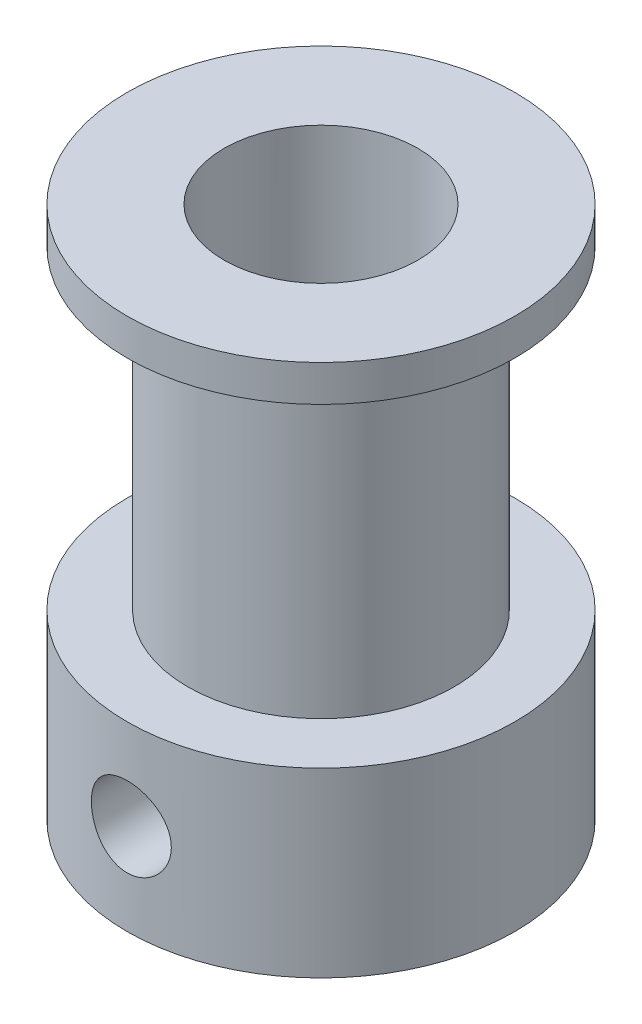
ISO-10303-21;
HEADER;
FILE_DESCRIPTION(('STEP AP214'),'2;1');
FILE_NAME('part.step','',(''),(''),'','','');
FILE_SCHEMA(('AUTOMOTIVE_DESIGN { 1 0 10303 214 1 1 1 1 }'));
ENDSEC;
DATA;
#1=APPLICATION_CONTEXT('core data for automotive mechanical design processes');
#2=APPLICATION_PROTOCOL_DEFINITION('international standard','automotive_design',2000,#1);
#3=PRODUCT_CONTEXT('',#1,'mechanical');
#4=PRODUCT('Part','Part','',(#3));
#5=PRODUCT_RELATED_PRODUCT_CATEGORY('part','',(#4));
#6=PRODUCT_DEFINITION_FORMATION('','',#4);
#7=PRODUCT_DEFINITION_CONTEXT('part definition',#1,'design');
#8=PRODUCT_DEFINITION('design','',#6,#7);
#9=PRODUCT_DEFINITION_SHAPE('','',#8);
#10=(LENGTH_UNIT() NAMED_UNIT(*) SI_UNIT(.MILLI.,.METRE.));
#11=(NAMED_UNIT(*) PLANE_ANGLE_UNIT() SI_UNIT($,.RADIAN.));
#12=(NAMED_UNIT(*) SI_UNIT($,.STERADIAN.) SOLID_ANGLE_UNIT());
#13=UNCERTAINTY_MEASURE_WITH_UNIT(LENGTH_MEASURE(1.E-05),#10,'distance_accuracy_value','');
#14=(GEOMETRIC_REPRESENTATION_CONTEXT(3) GLOBAL_UNCERTAINTY_ASSIGNED_CONTEXT((#13)) GLOBAL_UNIT_ASSIGNED_CONTEXT((#10,
#11,#12)) REPRESENTATION_CONTEXT('',''));
#15=CARTESIAN_POINT('',(0.,0.,0.));
#16=DIRECTION('',(0.,0.,1.));
#17=DIRECTION('',(1.,0.,0.));
#18=AXIS2_PLACEMENT_3D('',#15,#16,#17);
#19=CARTESIAN_POINT('',(0.,7.5,0.));
#20=DIRECTION('',(0.,1.,0.));
#21=DIRECTION('',(0.,0.,1.));
#22=AXIS2_PLACEMENT_3D('',#19,#20,#21);
#23=PLANE('',#22);
#24=CARTESIAN_POINT('',(0.,7.5,0.));
#25=DIRECTION('',(0.,1.,0.));
#26=DIRECTION('',(0.,0.,1.));
#27=AXIS2_PLACEMENT_3D('',#24,#25,#26);
#28=CIRCLE('',#27,8.);
#29=CARTESIAN_POINT('',(0.,7.5,8.));
#30=VERTEX_POINT('',#29);
#31=EDGE_CURVE('E10',#30,#30,#28,.T.);
#32=ORIENTED_EDGE('',*,*,#31,.T.);
#33=EDGE_LOOP('',(#32));
#34=FACE_BOUND('',#33,.T.);
#35=CARTESIAN_POINT('',(0.,7.5,0.));
#36=DIRECTION('',(0.,1.,0.));
#37=DIRECTION('',(0.,0.,1.));
#38=AXIS2_PLACEMENT_3D('',#35,#36,#37);
#39=CIRCLE('',#38,5.5);
#40=CARTESIAN_POINT('',(0.,7.5,-5.5));
#41=VERTEX_POINT('',#40);
#42=EDGE_CURVE('E47',#41,#41,#39,.T.);
#43=ORIENTED_EDGE('',*,*,#42,.F.);
#44=EDGE_LOOP('',(#43));
#45=FACE_BOUND('',#44,.T.);
#46=ADVANCED_FACE('F34',(#34,#45),#23,.T.);
#47=CARTESIAN_POINT('',(0.,7.5,0.));
#48=DIRECTION('',(0.,-1.,0.));
#49=DIRECTION('',(0.,0.,-1.));
#50=AXIS2_PLACEMENT_3D('',#47,#48,#49);
#51=CYLINDRICAL_SURFACE('',#50,8.);
#52=CARTESIAN_POINT('',(-7.82799463464302,3.75,-1.65000000000002));
#53=CARTESIAN_POINT('',(-7.82799647234761,3.84161734979413,-1.64999668532495));
#54=CARTESIAN_POINT('',(-7.82962054015776,3.93327581475285,-1.64234339972767));
#55=CARTESIAN_POINT('',(-7.83593102109728,4.11399536908582,-1.61196056082938));
#56=CARTESIAN_POINT('',(-7.84061980768031,4.20305438944651,-1.5892193225455));
#57=CARTESIAN_POINT('',(-7.85250661788931,4.37593449220463,-1.52939944297716));
#58=CARTESIAN_POINT('',(-7.85970206178507,4.45976085561278,-1.49233553761894));
#59=CARTESIAN_POINT('',(-7.87578836285869,4.62000460226487,-1.40496339378159));
#60=CARTESIAN_POINT('',(-7.88467914491255,4.69642231357555,-1.35465574212319));
#61=CARTESIAN_POINT('',(-7.90330366333984,4.84083130314562,-1.24141806188278));
#62=CARTESIAN_POINT('',(-7.91304715328143,4.90869500128048,-1.17832691131061));
#63=CARTESIAN_POINT('',(-7.93219354684102,5.03295461376032,-1.04166118718971));
#64=CARTESIAN_POINT('',(-7.9415964257225,5.08934969657567,-0.968085854144728));
#65=CARTESIAN_POINT('',(-7.95910768239297,5.18956942635827,-0.811692001393481));
#66=CARTESIAN_POINT('',(-7.9672032148807,5.23327235381807,-0.728793920101091));
#67=CARTESIAN_POINT('',(-7.98107786735649,5.30608110943423,-0.556636173632906));
#68=CARTESIAN_POINT('',(-7.9868572180665,5.33518839158008,-0.467377143134544));
#69=CARTESIAN_POINT('',(-7.99537941797959,5.37758111250497,-0.286356118265347));
#70=CARTESIAN_POINT('',(-7.99816360714569,5.39108215209675,-0.194646593521417));
#71=CARTESIAN_POINT('',(-8.00052470522147,5.40255227142173,-0.0102247919218536));
#72=CARTESIAN_POINT('',(-8.00010194196704,5.40052293877214,0.0824873814688407));
#73=CARTESIAN_POINT('',(-7.9961286601365,5.3811524880959,0.264799667160857));
#74=CARTESIAN_POINT('',(-7.99262559257093,5.36404365512093,0.354425644609033));
#75=CARTESIAN_POINT('',(-7.98293899531616,5.3153688535758,0.529506535845897));
#76=CARTESIAN_POINT('',(-7.97675535366161,5.28380228111471,0.614961275239523));
#77=CARTESIAN_POINT('',(-7.96232481023259,5.20689604030914,0.779930808135305));
#78=CARTESIAN_POINT('',(-7.95406448397429,5.161466330109,0.859402403191171));
#79=CARTESIAN_POINT('',(-7.93638961806162,5.05819018594217,1.00967984091352));
#80=CARTESIAN_POINT('',(-7.9269749376687,5.00034223730045,1.08048462481767));
#81=CARTESIAN_POINT('',(-7.9078239642189,4.87260050730487,1.21279807501822));
#82=CARTESIAN_POINT('',(-7.89808494418977,4.80250342398988,1.27411022634261));
#83=CARTESIAN_POINT('',(-7.87954771497238,4.65292295474092,1.38414252261931));
#84=CARTESIAN_POINT('',(-7.87074952591437,4.57343936804768,1.43286239817595));
#85=CARTESIAN_POINT('',(-7.85508413098618,4.40704845467704,1.51640121308691));
#86=CARTESIAN_POINT('',(-7.84822159457677,4.32012382444695,1.55118662114804));
#87=CARTESIAN_POINT('',(-7.83727167258975,4.14148889177413,1.60559987539901));
#88=CARTESIAN_POINT('',(-7.83318390018328,4.04977925832742,1.625229834457));
#89=CARTESIAN_POINT('',(-7.82832430034405,3.86596343547278,1.64847767759944));
#90=CARTESIAN_POINT('',(-7.82749355348184,3.77389475085064,1.65238010858403));
#91=CARTESIAN_POINT('',(-7.82908365669821,3.59042212630601,1.64482933127382));
#92=CARTESIAN_POINT('',(-7.83150430988349,3.49901814646834,1.63337705280602));
#93=CARTESIAN_POINT('',(-7.83926913983493,3.32043707429369,1.59568777426683));
#94=CARTESIAN_POINT('',(-7.84458293687797,3.23322613369048,1.56960432546506));
#95=CARTESIAN_POINT('',(-7.85750843647708,3.06441223673719,1.50355797289369));
#96=CARTESIAN_POINT('',(-7.86512033846231,2.98280976784409,1.46359386451762));
#97=CARTESIAN_POINT('',(-7.88191579950282,2.82628854815773,1.37028211396983));
#98=CARTESIAN_POINT('',(-7.89111960565472,2.75147762450433,1.31675731908656));
#99=CARTESIAN_POINT('',(-7.91000699478186,2.61179547619869,1.1980782934733));
#100=CARTESIAN_POINT('',(-7.91969063034348,2.54692534419905,1.13292278604277));
#101=CARTESIAN_POINT('',(-7.93863877717958,2.42787906230575,0.991551131023601));
#102=CARTESIAN_POINT('',(-7.94789380519354,2.37389583014193,0.91517105125856));
#103=CARTESIAN_POINT('',(-7.96477402593325,2.27952771722255,0.754260738130239));
#104=CARTESIAN_POINT('',(-7.97239928979603,2.23914224289872,0.669730860728551));
#105=CARTESIAN_POINT('',(-7.98512048804082,2.17339319408157,0.495414150876506));
#106=CARTESIAN_POINT('',(-7.99023131933467,2.14794096923201,0.405661891513242));
#107=CARTESIAN_POINT('',(-7.99741186635557,2.11250124752192,0.223039444294558));
#108=CARTESIAN_POINT('',(-7.99948197278732,2.10251176383492,0.130169658580894));
#109=CARTESIAN_POINT('',(-8.00033781964049,2.09836207224363,-0.054212649205602));
#110=CARTESIAN_POINT('',(-7.99918360281958,2.10391248751722,-0.145718502140326));
#111=CARTESIAN_POINT('',(-7.99384751004402,2.13004339509045,-0.326463478938194));
#112=CARTESIAN_POINT('',(-7.98966567723011,2.15062367322843,-0.415702635080924));
#113=CARTESIAN_POINT('',(-7.97874682116245,2.2060981411582,-0.589186560182822));
#114=CARTESIAN_POINT('',(-7.97201637401338,2.24095551098701,-0.673443542985833));
#115=CARTESIAN_POINT('',(-7.95672300876336,2.32395704210639,-0.834953513276977));
#116=CARTESIAN_POINT('',(-7.9481599348062,2.37210233357252,-0.912205904261803));
#117=CARTESIAN_POINT('',(-7.92995681960444,2.48127864528561,-1.05893847166516));
#118=CARTESIAN_POINT('',(-7.92030089151861,2.54251556975004,-1.12826349061001));
#119=CARTESIAN_POINT('',(-7.90109178015231,2.67571624164646,-1.25575285452555));
#120=CARTESIAN_POINT('',(-7.89153862187156,2.74768253854538,-1.31391453937946));
#121=CARTESIAN_POINT('',(-7.87349423401939,2.9013011038279,-1.41807001635076));
#122=CARTESIAN_POINT('',(-7.86501660134748,2.98305600230841,-1.46391490783106));
#123=CARTESIAN_POINT('',(-7.85025069483304,3.15326288616914,-1.54114313624578));
#124=CARTESIAN_POINT('',(-7.84396047891661,3.2417088455668,-1.57253930936732));
#125=CARTESIAN_POINT('',(-7.83550744278865,3.40026722430231,-1.6140462079898));
#126=CARTESIAN_POINT('',(-7.83270799535492,3.46948894840103,-1.6275042042483));
#127=CARTESIAN_POINT('',(-7.82895092043293,3.60913237654465,-1.64548220150441));
#128=CARTESIAN_POINT('',(-7.82799322160417,3.67955403400329,-1.65000254870381));
#129=CARTESIAN_POINT('',(-7.82799463464302,3.75,-1.65000000000002));
#130=B_SPLINE_CURVE_WITH_KNOTS('',3,(#52,#53,#54,#55,#56,#57,#58,#59,#60,#61,#62,#63,#64,#65,
#66,#67,#68,#69,#70,#71,#72,#73,#74,#75,#76,#77,#78,#79,#80,#81,#82,#83,#84,#85,#86,#87,#88,#89,
#90,#91,#92,#93,#94,#95,#96,#97,#98,#99,#100,#101,#102,#103,#104,#105,#106,#107,#108,#109,#110,
#111,#112,#113,#114,#115,#116,#117,#118,#119,#120,#121,#122,#123,#124,#125,#126,#127,#128,#129),
.UNSPECIFIED.,.T.,.F.,(4,2,2,2,2,2,2,2,2,2,2,2,2,2,2,2,2,2,2,2,2,2,2,2,2,2,2,2,2,2,2,2,2,2,2,2,
2,2,4),(0.,0.274594036981749,0.549400984088786,0.823925944657621,1.09843874327276,
1.3766547467594,1.65489091505464,1.93571338943598,2.21650788327397,2.49337499570617,
2.77021380533169,3.04286128513493,3.31552015429503,3.58998907522695,3.86449149267072,
4.14407920367273,4.4236728956019,4.70393540521657,4.9841588355065,5.25928898855093,
5.53440248143716,5.80668132243981,6.07898379854718,6.35504561674318,6.6311377568341,
6.91175972338565,7.19236943866019,7.47129602001294,7.75018675877315,8.02391884651822,
8.29764703391013,8.57067368982019,8.84372357458458,9.1214337806041,9.39921008040027,
9.68020708192079,9.96095396255218,10.1721016499172,10.38324115827),.UNSPECIFIED.);
#131=CARTESIAN_POINT('',(-7.82799463464302,3.75,-1.65000000000002));
#132=VERTEX_POINT('',#131);
#133=EDGE_CURVE('E93',#132,#132,#130,.T.);
#134=ORIENTED_EDGE('',*,*,#133,.T.);
#135=EDGE_LOOP('',(#134));
#136=FACE_BOUND('',#135,.T.);
#137=CARTESIAN_POINT('',(-1.64999999999999,3.75,7.82799463464303));
#138=CARTESIAN_POINT('',(-1.64999668532493,3.84161734979413,7.82799647234762));
#139=CARTESIAN_POINT('',(-1.64234339972764,3.93327581475285,7.82962054015776));
#140=CARTESIAN_POINT('',(-1.61196056082935,4.11399536908582,7.83593102109728));
#141=CARTESIAN_POINT('',(-1.58921932254547,4.20305438944651,7.84061980768031));
#142=CARTESIAN_POINT('',(-1.52939944297714,4.37593449220463,7.85250661788931));
#143=CARTESIAN_POINT('',(-1.49233553761891,4.45976085561278,7.85970206178508));
#144=CARTESIAN_POINT('',(-1.40496339378156,4.62000460226487,7.8757883628587));
#145=CARTESIAN_POINT('',(-1.35465574212316,4.69642231357555,7.88467914491256));
#146=CARTESIAN_POINT('',(-1.24141806188275,4.84083130314562,7.90330366333985));
#147=CARTESIAN_POINT('',(-1.17832691131059,4.90869500128048,7.91304715328143));
#148=CARTESIAN_POINT('',(-1.04166118718968,5.03295461376032,7.93219354684102));
#149=CARTESIAN_POINT('',(-0.9680858541447,5.08934969657567,7.9415964257225));
#150=CARTESIAN_POINT('',(-0.811692001393454,5.18956942635827,7.95910768239297));
#151=CARTESIAN_POINT('',(-0.728793920101063,5.23327235381807,7.9672032148807));
#152=CARTESIAN_POINT('',(-0.556636173632879,5.30608110943423,7.98107786735649));
#153=CARTESIAN_POINT('',(-0.467377143134516,5.33518839158008,7.9868572180665));
#154=CARTESIAN_POINT('',(-0.28635611826532,5.37758111250497,7.99537941797959));
#155=CARTESIAN_POINT('',(-0.194646593521389,5.39108215209675,7.99816360714569));
#156=CARTESIAN_POINT('',(-0.010224791921826,5.40255227142173,8.00052470522147));
#157=CARTESIAN_POINT('',(0.0824873814688682,5.40052293877214,8.00010194196704));
#158=CARTESIAN_POINT('',(0.264799667160884,5.3811524880959,7.9961286601365));
#159=CARTESIAN_POINT('',(0.354425644609061,5.36404365512093,7.99262559257093));
#160=CARTESIAN_POINT('',(0.529506535845924,5.3153688535758,7.98293899531616));
#161=CARTESIAN_POINT('',(0.61496127523955,5.28380228111471,7.97675535366161));
#162=CARTESIAN_POINT('',(0.779930808135332,5.20689604030914,7.96232481023259));
#163=CARTESIAN_POINT('',(0.859402403191199,5.161466330109,7.95406448397429));
#164=CARTESIAN_POINT('',(1.00967984091354,5.05819018594217,7.93638961806161));
#165=CARTESIAN_POINT('',(1.08048462481769,5.00034223730045,7.92697493766869));
#166=CARTESIAN_POINT('',(1.21279807501824,4.87260050730487,7.9078239642189));
#167=CARTESIAN_POINT('',(1.27411022634264,4.80250342398989,7.89808494418976));
#168=CARTESIAN_POINT('',(1.38414252261934,4.65292295474092,7.87954771497238));
#169=CARTESIAN_POINT('',(1.43286239817597,4.57343936804768,7.87074952591437));
#170=CARTESIAN_POINT('',(1.51640121308694,4.40704845467704,7.85508413098618));
#171=CARTESIAN_POINT('',(1.55118662114807,4.32012382444695,7.84822159457677));
#172=CARTESIAN_POINT('',(1.60559987539903,4.14148889177413,7.83727167258975));
#173=CARTESIAN_POINT('',(1.62522983445702,4.04977925832743,7.83318390018328));
#174=CARTESIAN_POINT('',(1.64847767759947,3.86596343547278,7.82832430034404));
#175=CARTESIAN_POINT('',(1.65238010858406,3.77389475085064,7.82749355348184));
#176=CARTESIAN_POINT('',(1.64482933127385,3.59042212630601,7.8290836566982));
#177=CARTESIAN_POINT('',(1.63337705280605,3.49901814646834,7.83150430988348));
#178=CARTESIAN_POINT('',(1.59568777426686,3.32043707429369,7.83926913983493));
#179=CARTESIAN_POINT('',(1.56960432546508,3.23322613369048,7.84458293687796));
#180=CARTESIAN_POINT('',(1.50355797289372,3.06441223673719,7.85750843647708));
#181=CARTESIAN_POINT('',(1.46359386451765,2.98280976784409,7.8651203384623));
#182=CARTESIAN_POINT('',(1.37028211396986,2.82628854815773,7.88191579950281));
#183=CARTESIAN_POINT('',(1.31675731908659,2.75147762450433,7.89111960565472));
#184=CARTESIAN_POINT('',(1.19807829347332,2.61179547619869,7.91000699478186));
#185=CARTESIAN_POINT('',(1.1329227860428,2.54692534419906,7.91969063034348));
#186=CARTESIAN_POINT('',(0.99155113102363,2.42787906230575,7.93863877717957));
#187=CARTESIAN_POINT('',(0.915171051258588,2.37389583014193,7.94789380519354));
#188=CARTESIAN_POINT('',(0.754260738130267,2.27952771722255,7.96477402593325));
#189=CARTESIAN_POINT('',(0.66973086072858,2.23914224289872,7.97239928979603));
#190=CARTESIAN_POINT('',(0.495414150876535,2.17339319408157,7.98512048804082));
#191=CARTESIAN_POINT('',(0.405661891513271,2.14794096923201,7.99023131933467));
#192=CARTESIAN_POINT('',(0.223039444294587,2.11250124752192,7.99741186635557));
#193=CARTESIAN_POINT('',(0.130169658580922,2.10251176383492,7.99948197278732));
#194=CARTESIAN_POINT('',(-0.0542126492055734,2.09836207224363,8.00033781964049));
#195=CARTESIAN_POINT('',(-0.145718502140298,2.10391248751722,7.99918360281958));
#196=CARTESIAN_POINT('',(-0.326463478938166,2.13004339509045,7.99384751004402));
#197=CARTESIAN_POINT('',(-0.415702635080896,2.15062367322843,7.98966567723011));
#198=CARTESIAN_POINT('',(-0.589186560182793,2.2060981411582,7.97874682116246));
#199=CARTESIAN_POINT('',(-0.673443542985804,2.240955510987,7.97201637401338));
#200=CARTESIAN_POINT('',(-0.834953513276948,2.32395704210639,7.95672300876336));
#201=CARTESIAN_POINT('',(-0.912205904261775,2.37210233357252,7.9481599348062));
#202=CARTESIAN_POINT('',(-1.05893847166513,2.48127864528561,7.92995681960444));
#203=CARTESIAN_POINT('',(-1.12826349060999,2.54251556975004,7.92030089151861));
#204=CARTESIAN_POINT('',(-1.25575285452552,2.67571624164646,7.90109178015231));
#205=CARTESIAN_POINT('',(-1.31391453937944,2.74768253854538,7.89153862187157));
#206=CARTESIAN_POINT('',(-1.41807001635073,2.90130110382791,7.8734942340194));
#207=CARTESIAN_POINT('',(-1.46391490783103,2.98305600230841,7.86501660134749));
#208=CARTESIAN_POINT('',(-1.54114313624576,3.15326288616914,7.85025069483304));
#209=CARTESIAN_POINT('',(-1.57253930936729,3.2417088455668,7.84396047891661));
#210=CARTESIAN_POINT('',(-1.61404620798977,3.40026722430231,7.83550744278865));
#211=CARTESIAN_POINT('',(-1.62750420424827,3.46948894840103,7.83270799535493));
#212=CARTESIAN_POINT('',(-1.64548220150438,3.60913237654465,7.82895092043294));
#213=CARTESIAN_POINT('',(-1.65000254870379,3.67955403400329,7.82799322160417));
#214=CARTESIAN_POINT('',(-1.64999999999999,3.75,7.82799463464303));
#215=B_SPLINE_CURVE_WITH_KNOTS('',3,(#137,#138,#139,#140,#141,#142,#143,#144,#145,#146,#147,
#148,#149,#150,#151,#152,#153,#154,#155,#156,#157,#158,#159,#160,#161,#162,#163,#164,#165,#166,
#167,#168,#169,#170,#171,#172,#173,#174,#175,#176,#177,#178,#179,#180,#181,#182,#183,#184,#185,
#186,#187,#188,#189,#190,#191,#192,#193,#194,#195,#196,#197,#198,#199,#200,#201,#202,#203,#204,
#205,#206,#207,#208,#209,#210,#211,#212,#213,#214),.UNSPECIFIED.,.T.,.F.,(4,2,2,2,2,2,2,2,2,2,2,
2,2,2,2,2,2,2,2,2,2,2,2,2,2,2,2,2,2,2,2,2,2,2,2,2,2,2,4),(0.,0.274594036981749,
0.549400984088785,0.82392594465762,1.09843874327276,1.3766547467594,1.65489091505464,
1.93571338943597,2.21650788327397,2.49337499570617,2.77021380533169,3.04286128513493,
3.31552015429503,3.58998907522695,3.86449149267071,4.14407920367273,4.42367289560189,
4.70393540521657,4.9841588355065,5.25928898855093,5.53440248143716,5.8066813224398,
6.07898379854718,6.35504561674318,6.6311377568341,6.91175972338564,7.19236943866019,
7.47129602001293,7.75018675877315,8.02391884651822,8.29764703391013,8.57067368982019,
8.84372357458458,9.1214337806041,9.39921008040027,9.68020708192079,9.96095396255218,
10.1721016499172,10.38324115827),.UNSPECIFIED.);
#216=CARTESIAN_POINT('',(-1.64999999999999,3.75,7.82799463464303));
#217=VERTEX_POINT('',#216);
#218=EDGE_CURVE('E72',#217,#217,#215,.T.);
#219=ORIENTED_EDGE('',*,*,#218,.T.);
#220=EDGE_LOOP('',(#219));
#221=FACE_BOUND('',#220,.T.);
#222=ORIENTED_EDGE('',*,*,#31,.F.);
#223=EDGE_LOOP('',(#222));
#224=FACE_BOUND('',#223,.T.);
#225=CARTESIAN_POINT('',(0.,0.,0.));
#226=DIRECTION('',(0.,1.,0.));
#227=DIRECTION('',(0.,0.,1.));
#228=AXIS2_PLACEMENT_3D('',#225,#226,#227);
#229=CIRCLE('',#228,8.);
#230=CARTESIAN_POINT('',(0.,0.,8.));
#231=VERTEX_POINT('',#230);
#232=EDGE_CURVE('E38',#231,#231,#229,.T.);
#233=ORIENTED_EDGE('',*,*,#232,.T.);
#234=EDGE_LOOP('',(#233));
#235=FACE_BOUND('',#234,.T.);
#236=ADVANCED_FACE('F36',(#136,#221,#224,#235),#51,.T.);
#237=CARTESIAN_POINT('',(0.,0.,0.));
#238=DIRECTION('',(0.,1.,0.));
#239=DIRECTION('',(0.,0.,1.));
#240=AXIS2_PLACEMENT_3D('',#237,#238,#239);
#241=PLANE('',#240);
#242=CARTESIAN_POINT('',(0.,0.,0.));
#243=DIRECTION('',(0.,1.,0.));
#244=DIRECTION('',(0.,0.,1.));
#245=AXIS2_PLACEMENT_3D('',#242,#243,#244);
#246=CIRCLE('',#245,4.);
#247=CARTESIAN_POINT('',(0.,0.,4.));
#248=VERTEX_POINT('',#247);
#249=EDGE_CURVE('E56',#248,#248,#246,.T.);
#250=ORIENTED_EDGE('',*,*,#249,.T.);
#251=EDGE_LOOP('',(#250));
#252=FACE_BOUND('',#251,.T.);
#253=ORIENTED_EDGE('',*,*,#232,.F.);
#254=EDGE_LOOP('',(#253));
#255=FACE_BOUND('',#254,.T.);
#256=ADVANCED_FACE('F138',(#252,#255),#241,.F.);
#257=CARTESIAN_POINT('',(0.,20.5,0.));
#258=DIRECTION('',(0.,-1.,0.));
#259=DIRECTION('',(0.,0.,-1.));
#260=AXIS2_PLACEMENT_3D('',#257,#258,#259);
#261=CYLINDRICAL_SURFACE('',#260,5.5);
#262=CARTESIAN_POINT('',(0.,20.5,0.));
#263=DIRECTION('',(0.,1.,0.));
#264=DIRECTION('',(0.,0.,1.));
#265=AXIS2_PLACEMENT_3D('',#262,#263,#264);
#266=CIRCLE('',#265,5.5);
#267=CARTESIAN_POINT('',(0.,20.5,-5.5));
#268=VERTEX_POINT('',#267);
#269=EDGE_CURVE('E45',#268,#268,#266,.T.);
#270=CARTESIAN_POINT('',(0.,20.5,-5.5));
#271=CARTESIAN_POINT('',(0.,20.3645833333333,-5.5));
#272=CARTESIAN_POINT('',(0.,20.2291666666667,-5.5));
#273=CARTESIAN_POINT('',(0.,19.9583333333333,-5.5));
#274=CARTESIAN_POINT('',(0.,19.8229166666667,-5.5));
#275=CARTESIAN_POINT('',(0.,19.5520833333333,-5.5));
#276=CARTESIAN_POINT('',(0.,19.4166666666667,-5.5));
#277=CARTESIAN_POINT('',(0.,19.1458333333333,-5.5));
#278=CARTESIAN_POINT('',(0.,19.0104166666667,-5.5));
#279=CARTESIAN_POINT('',(0.,18.7395833333333,-5.5));
#280=CARTESIAN_POINT('',(0.,18.6041666666667,-5.5));
#281=CARTESIAN_POINT('',(0.,18.3333333333333,-5.5));
#282=CARTESIAN_POINT('',(0.,18.1979166666667,-5.5));
#283=CARTESIAN_POINT('',(0.,17.9270833333333,-5.5));
#284=CARTESIAN_POINT('',(0.,17.7916666666667,-5.5));
#285=CARTESIAN_POINT('',(0.,17.5208333333333,-5.5));
#286=CARTESIAN_POINT('',(0.,17.3854166666667,-5.5));
#287=CARTESIAN_POINT('',(0.,17.1145833333333,-5.5));
#288=CARTESIAN_POINT('',(0.,16.9791666666667,-5.5));
#289=CARTESIAN_POINT('',(0.,16.7083333333333,-5.5));
#290=CARTESIAN_POINT('',(0.,16.5729166666667,-5.5));
#291=CARTESIAN_POINT('',(0.,16.3020833333333,-5.5));
#292=CARTESIAN_POINT('',(0.,16.1666666666667,-5.5));
#293=CARTESIAN_POINT('',(0.,15.8958333333333,-5.5));
#294=CARTESIAN_POINT('',(0.,15.7604166666667,-5.5));
#295=CARTESIAN_POINT('',(0.,15.4895833333333,-5.5));
#296=CARTESIAN_POINT('',(0.,15.3541666666667,-5.5));
#297=CARTESIAN_POINT('',(0.,15.0833333333333,-5.5));
#298=CARTESIAN_POINT('',(0.,14.9479166666667,-5.5));
#299=CARTESIAN_POINT('',(0.,14.6770833333333,-5.5));
#300=CARTESIAN_POINT('',(0.,14.5416666666667,-5.5));
#301=CARTESIAN_POINT('',(0.,14.2708333333333,-5.5));
#302=CARTESIAN_POINT('',(0.,14.1354166666667,-5.5));
#303=CARTESIAN_POINT('',(0.,13.8645833333333,-5.5));
#304=CARTESIAN_POINT('',(0.,13.7291666666667,-5.5));
#305=CARTESIAN_POINT('',(0.,13.4583333333333,-5.5));
#306=CARTESIAN_POINT('',(0.,13.3229166666667,-5.5));
#307=CARTESIAN_POINT('',(0.,13.0520833333333,-5.5));
#308=CARTESIAN_POINT('',(0.,12.9166666666667,-5.5));
#309=CARTESIAN_POINT('',(0.,12.6458333333333,-5.5));
#310=CARTESIAN_POINT('',(0.,12.5104166666667,-5.5));
#311=CARTESIAN_POINT('',(0.,12.2395833333333,-5.5));
#312=CARTESIAN_POINT('',(0.,12.1041666666667,-5.5));
#313=CARTESIAN_POINT('',(0.,11.8333333333333,-5.5));
#314=CARTESIAN_POINT('',(0.,11.6979166666667,-5.5));
#315=CARTESIAN_POINT('',(0.,11.4270833333333,-5.5));
#316=CARTESIAN_POINT('',(0.,11.2916666666667,-5.5));
#317=CARTESIAN_POINT('',(0.,11.0208333333333,-5.5));
#318=CARTESIAN_POINT('',(0.,10.8854166666667,-5.5));
#319=CARTESIAN_POINT('',(0.,10.6145833333333,-5.5));
#320=CARTESIAN_POINT('',(0.,10.4791666666667,-5.5));
#321=CARTESIAN_POINT('',(0.,10.2083333333333,-5.5));
#322=CARTESIAN_POINT('',(0.,10.0729166666667,-5.5));
#323=CARTESIAN_POINT('',(0.,9.80208333333333,-5.5));
#324=CARTESIAN_POINT('',(0.,9.66666666666667,-5.5));
#325=CARTESIAN_POINT('',(0.,9.39583333333333,-5.5));
#326=CARTESIAN_POINT('',(0.,9.26041666666666,-5.5));
#327=CARTESIAN_POINT('',(0.,8.98958333333333,-5.5));
#328=CARTESIAN_POINT('',(0.,8.85416666666666,-5.5));
#329=CARTESIAN_POINT('',(0.,8.58333333333333,-5.5));
#330=CARTESIAN_POINT('',(0.,8.44791666666666,-5.5));
#331=CARTESIAN_POINT('',(0.,8.17708333333333,-5.5));
#332=CARTESIAN_POINT('',(0.,8.04166666666667,-5.5));
#333=CARTESIAN_POINT('',(0.,7.77083333333333,-5.5));
#334=CARTESIAN_POINT('',(0.,7.63541666666666,-5.5));
#335=CARTESIAN_POINT('',(0.,7.5,-5.5));
#336=B_SPLINE_CURVE_WITH_KNOTS('',3,(#270,#271,#272,#273,#274,#275,#276,#277,#278,#279,#280,
#281,#282,#283,#284,#285,#286,#287,#288,#289,#290,#291,#292,#293,#294,#295,#296,#297,#298,#299,
#300,#301,#302,#303,#304,#305,#306,#307,#308,#309,#310,#311,#312,#313,#314,#315,#316,#317,#318,
#319,#320,#321,#322,#323,#324,#325,#326,#327,#328,#329,#330,#331,#332,#333,#334,#335),
.UNSPECIFIED.,.F.,.F.,(4,2,2,2,2,2,2,2,2,2,2,2,2,2,2,2,2,2,2,2,2,2,2,2,2,2,2,2,2,2,2,2,4),(0.,
0.406249999999997,0.812499999999997,1.21875,1.625,2.03125,2.4375,2.84375,3.25,3.65625,4.0625,
4.46875,4.875,5.28125,5.6875,6.09375,6.5,6.90625,7.3125,7.71875,8.125,8.53124999999999,8.9375,
9.34375,9.75,10.15625,10.5625,10.96875,11.375,11.78125,12.1875,12.59375,13.),.UNSPECIFIED.);
#337=EDGE_CURVE('BSEAM132',#268,#41,#336,.T.);
#338=ORIENTED_EDGE('',*,*,#269,.F.);
#339=ORIENTED_EDGE('',*,*,#42,.T.);
#340=ORIENTED_EDGE('',*,*,#337,.T.);
#341=ORIENTED_EDGE('',*,*,#337,.F.);
#342=EDGE_LOOP('',(#338,#340,#339,#341));
#343=FACE_BOUND('',#342,.T.);
#344=ADVANCED_FACE('F132',(#343),#261,.T.);
#345=CARTESIAN_POINT('',(0.,20.5,0.));
#346=DIRECTION('',(0.,1.,0.));
#347=DIRECTION('',(0.,0.,1.));
#348=AXIS2_PLACEMENT_3D('',#345,#346,#347);
#349=PLANE('',#348);
#350=CARTESIAN_POINT('',(0.,20.5,0.));
#351=DIRECTION('',(0.,1.,0.));
#352=DIRECTION('',(0.,0.,1.));
#353=AXIS2_PLACEMENT_3D('',#350,#351,#352);
#354=CIRCLE('',#353,8.);
#355=CARTESIAN_POINT('',(0.,20.5,8.));
#356=VERTEX_POINT('',#355);
#357=EDGE_CURVE('E53',#356,#356,#354,.T.);
#358=ORIENTED_EDGE('',*,*,#357,.F.);
#359=EDGE_LOOP('',(#358));
#360=FACE_BOUND('',#359,.T.);
#361=ORIENTED_EDGE('',*,*,#269,.T.);
#362=EDGE_LOOP('',(#361));
#363=FACE_BOUND('',#362,.T.);
#364=ADVANCED_FACE('F126',(#360,#363),#349,.F.);
#365=CARTESIAN_POINT('',(0.,22.,0.));
#366=DIRECTION('',(0.,-1.,0.));
#367=DIRECTION('',(0.,0.,-1.));
#368=AXIS2_PLACEMENT_3D('',#365,#366,#367);
#369=CYLINDRICAL_SURFACE('',#368,8.);
#370=CARTESIAN_POINT('',(0.,22.,0.));
#371=DIRECTION('',(0.,1.,0.));
#372=DIRECTION('',(0.,0.,1.));
#373=AXIS2_PLACEMENT_3D('',#370,#371,#372);
#374=CIRCLE('',#373,8.);
#375=CARTESIAN_POINT('',(0.,22.,8.));
#376=VERTEX_POINT('',#375);
#377=EDGE_CURVE('E50',#376,#376,#374,.T.);
#378=ORIENTED_EDGE('',*,*,#377,.F.);
#379=EDGE_LOOP('',(#378));
#380=FACE_BOUND('',#379,.T.);
#381=ORIENTED_EDGE('',*,*,#357,.T.);
#382=EDGE_LOOP('',(#381));
#383=FACE_BOUND('',#382,.T.);
#384=ADVANCED_FACE('F121',(#380,#383),#369,.T.);
#385=CARTESIAN_POINT('',(0.,22.,0.));
#386=DIRECTION('',(0.,1.,0.));
#387=DIRECTION('',(0.,0.,1.));
#388=AXIS2_PLACEMENT_3D('',#385,#386,#387);
#389=PLANE('',#388);
#390=CARTESIAN_POINT('',(0.,22.,0.));
#391=DIRECTION('',(0.,1.,0.));
#392=DIRECTION('',(0.,0.,1.));
#393=AXIS2_PLACEMENT_3D('',#390,#391,#392);
#394=CIRCLE('',#393,4.);
#395=CARTESIAN_POINT('',(0.,22.,4.));
#396=VERTEX_POINT('',#395);
#397=EDGE_CURVE('E59',#396,#396,#394,.T.);
#398=ORIENTED_EDGE('',*,*,#397,.F.);
#399=EDGE_LOOP('',(#398));
#400=FACE_BOUND('',#399,.T.);
#401=ORIENTED_EDGE('',*,*,#377,.T.);
#402=EDGE_LOOP('',(#401));
#403=FACE_BOUND('',#402,.T.);
#404=ADVANCED_FACE('F114',(#400,#403),#389,.T.);
#405=CARTESIAN_POINT('',(0.,0.,0.));
#406=DIRECTION('',(0.,1.,0.));
#407=DIRECTION('',(0.,0.,1.));
#408=AXIS2_PLACEMENT_3D('',#405,#406,#407);
#409=CYLINDRICAL_SURFACE('',#408,4.);
#410=CARTESIAN_POINT('',(-3.64383040220041,3.75,-1.65000000000001));
#411=CARTESIAN_POINT('',(-3.64383945275152,3.66190351977432,-1.64999056813103));
#412=CARTESIAN_POINT('',(-3.64707173267573,3.57365956802641,-1.64289989177359));
#413=CARTESIAN_POINT('',(-3.65959209124688,3.39971293892112,-1.61480845546374));
#414=CARTESIAN_POINT('',(-3.66889676295874,3.3140178994024,-1.5937695789634));
#415=CARTESIAN_POINT('',(-3.69231325052125,3.14799706186937,-1.53873536249639));
#416=CARTESIAN_POINT('',(-3.70640571161012,3.06765117978141,-1.50479212400174));
#417=CARTESIAN_POINT('',(-3.73778230052357,2.91381823316578,-1.42506535594207));
#418=CARTESIAN_POINT('',(-3.75506562873472,2.84032945721597,-1.37928479159596));
#419=CARTESIAN_POINT('',(-3.7920553041855,2.6977713121535,-1.27419856290372));
#420=CARTESIAN_POINT('',(-3.81184277704779,2.6291707442198,-1.21428518241361));
#421=CARTESIAN_POINT('',(-3.85094363418238,2.50264522809125,-1.08391072165484));
#422=CARTESIAN_POINT('',(-3.87025683535296,2.44472434852778,-1.01344563996365));
#423=CARTESIAN_POINT('',(-3.90721575035942,2.33882862869814,-0.860301943593392));
#424=CARTESIAN_POINT('',(-3.92475616703247,2.29137906729385,-0.777232390113601));
#425=CARTESIAN_POINT('',(-3.95520283117798,2.2113298546783,-0.603436361875868));
#426=CARTESIAN_POINT('',(-3.96811109652272,2.17872373565345,-0.512713242513056));
#427=CARTESIAN_POINT('',(-3.98726403378776,2.13097929334378,-0.33110517230441));
#428=CARTESIAN_POINT('',(-3.99381564337609,2.11503315207677,-0.240465625184504));
#429=CARTESIAN_POINT('',(-4.0006306156112,2.09845334814483,-0.0575763551498781));
#430=CARTESIAN_POINT('',(-4.00089647540932,2.097813604678,0.0346727137709419));
#431=CARTESIAN_POINT('',(-3.99529224160632,2.1114364961366,0.212297380895971));
#432=CARTESIAN_POINT('',(-3.98978733384659,2.1248121837171,0.297754665400383));
#433=CARTESIAN_POINT('',(-3.97375926025945,2.16456881744776,0.465085845235265));
#434=CARTESIAN_POINT('',(-3.96323572489497,2.19095072129069,0.546959476205478));
#435=CARTESIAN_POINT('',(-3.93798907731603,2.25628766172019,0.706295606817214));
#436=CARTESIAN_POINT('',(-3.92320447216363,2.29542798992488,0.783671979762454));
#437=CARTESIAN_POINT('',(-3.89088763760773,2.38499127918661,0.930960489992451));
#438=CARTESIAN_POINT('',(-3.87335444442337,2.43541820050331,1.0008699945393));
#439=CARTESIAN_POINT('',(-3.83587133640028,2.55018823902864,1.13638530947039));
#440=CARTESIAN_POINT('',(-3.8158381454309,2.61525341089873,1.20135746318643));
#441=CARTESIAN_POINT('',(-3.77653142784556,2.75540966632158,1.31973838423492));
#442=CARTESIAN_POINT('',(-3.75725818494774,2.83050444926331,1.373142865722));
#443=CARTESIAN_POINT('',(-3.7210660715691,2.99159840354732,1.46845339844826));
#444=CARTESIAN_POINT('',(-3.70424107982559,3.07786757169265,1.50994179309275));
#445=CARTESIAN_POINT('',(-3.67596385006486,3.2570466714059,1.57754508127094));
#446=CARTESIAN_POINT('',(-3.66450786071418,3.34995191387382,1.60367071206119));
#447=CARTESIAN_POINT('',(-3.64919091711419,3.53342289518499,1.6382132035594));
#448=CARTESIAN_POINT('',(-3.64489111171832,3.62375830118286,1.6476556945468));
#449=CARTESIAN_POINT('',(-3.64311980380968,3.8048056296986,1.65157101672825));
#450=CARTESIAN_POINT('',(-3.6456460160745,3.89551741605928,1.646048857804));
#451=CARTESIAN_POINT('',(-3.65678944366162,4.06880100904947,1.62112710501825));
#452=CARTESIAN_POINT('',(-3.66501803861665,4.15152817967461,1.60261202118541));
#453=CARTESIAN_POINT('',(-3.68614612916708,4.31263706437997,1.55339580262013));
#454=CARTESIAN_POINT('',(-3.69904670212357,4.39101777135166,1.52269185697121));
#455=CARTESIAN_POINT('',(-3.72872477858183,4.54487900569563,1.44853902204983));
#456=CARTESIAN_POINT('',(-3.74564214050946,4.62010019477924,1.40460979308262));
#457=CARTESIAN_POINT('',(-3.78124523189865,4.76246016942973,1.30573455409449));
#458=CARTESIAN_POINT('',(-3.79993171387675,4.82959548773512,1.25078384473682));
#459=CARTESIAN_POINT('',(-3.83876011670653,4.95942962644671,1.12627542162097));
#460=CARTESIAN_POINT('',(-3.85889967217623,5.02135173704872,1.05590387126702));
#461=CARTESIAN_POINT('',(-3.89698114804695,5.13264285566206,0.905297980080087));
#462=CARTESIAN_POINT('',(-3.91492292631237,5.18201105200319,0.825063002026887));
#463=CARTESIAN_POINT('',(-3.94668767391886,5.26670413420678,0.656516816883251));
#464=CARTESIAN_POINT('',(-3.96050313975064,5.30200347500272,0.568191273870476));
#465=CARTESIAN_POINT('',(-3.98237104121022,5.35699165685874,0.386140833605162));
#466=CARTESIAN_POINT('',(-3.9904268305481,5.37668958293893,0.292419112817546));
#467=CARTESIAN_POINT('',(-3.9994889299446,5.39878822892048,0.109187189544822));
#468=CARTESIAN_POINT('',(-4.00094173424749,5.40228482874193,0.0198303081186213));
#469=CARTESIAN_POINT('',(-3.99786220239438,5.39481456562971,-0.158161739195425));
#470=CARTESIAN_POINT('',(-3.99333087896147,5.38385015000454,-0.246797024648493));
#471=CARTESIAN_POINT('',(-3.979024148364,5.34855535786443,-0.417705375935888));
#472=CARTESIAN_POINT('',(-3.96943363922013,5.32469555788544,-0.500092371627863));
#473=CARTESIAN_POINT('',(-3.94605480923815,5.26479588512,-0.65966735573417));
#474=CARTESIAN_POINT('',(-3.93226568297162,5.22875367521331,-0.736854343148754));
#475=CARTESIAN_POINT('',(-3.90105808483759,5.14369547331361,-0.887661133732629));
#476=CARTESIAN_POINT('',(-3.88350423911689,5.09416874322707,-0.96096421436116));
#477=CARTESIAN_POINT('',(-3.84685709666619,4.98429715321,-1.09852932170706));
#478=CARTESIAN_POINT('',(-3.82776324400832,4.92394837691919,-1.16278806031651));
#479=CARTESIAN_POINT('',(-3.78859741195737,4.78941247264534,-1.28487769945048));
#480=CARTESIAN_POINT('',(-3.76854475207571,4.71457224311506,-1.34199767947158));
#481=CARTESIAN_POINT('',(-3.73105419200533,4.55573402431893,-1.44296474677331));
#482=CARTESIAN_POINT('',(-3.71361773967119,4.47173100829041,-1.48680449811904));
#483=CARTESIAN_POINT('',(-3.68370387904713,4.2972715587301,-1.55944447766652));
#484=CARTESIAN_POINT('',(-3.67119480418033,4.2068608919089,-1.58834112875234));
#485=CARTESIAN_POINT('',(-3.65281837075146,4.02195285592164,-1.63017263567573));
#486=CARTESIAN_POINT('',(-3.64692873900432,3.92747030912313,-1.64316103312975));
#487=CARTESIAN_POINT('',(-3.64414054419779,3.80513668635736,-1.6493120932942));
#488=CARTESIAN_POINT('',(-3.64382756923722,3.77757556771498,-1.65000295232161));
#489=CARTESIAN_POINT('',(-3.64383040220041,3.75,-1.65000000000001));
#490=B_SPLINE_CURVE_WITH_KNOTS('',3,(#410,#411,#412,#413,#414,#415,#416,#417,#418,#419,#420,
#421,#422,#423,#424,#425,#426,#427,#428,#429,#430,#431,#432,#433,#434,#435,#436,#437,#438,#439,
#440,#441,#442,#443,#444,#445,#446,#447,#448,#449,#450,#451,#452,#453,#454,#455,#456,#457,#458,
#459,#460,#461,#462,#463,#464,#465,#466,#467,#468,#469,#470,#471,#472,#473,#474,#475,#476,#477,
#478,#479,#480,#481,#482,#483,#484,#485,#486,#487,#488,#489),.UNSPECIFIED.,.T.,.F.,(4,2,2,2,2,2,
2,2,2,2,2,2,2,2,2,2,2,2,2,2,2,2,2,2,2,2,2,2,2,2,2,2,2,2,2,2,2,2,2,4),(0.,0.264211724660743,
0.529148459018595,0.793026677872046,1.05683885985755,1.33523297260791,1.61373292676209,
1.90403076094907,2.19420198072698,2.46953816244269,2.74476495901023,3.00356896819765,
3.2623920368679,3.52515526924738,3.78801084539544,4.06907613148063,4.35024537535723,
4.64031806272421,4.93018777241108,5.20152035698261,5.4727621157604,5.72713321026164,
5.98156300028878,6.24665916965706,6.51186861189121,6.79815687284344,7.0844636389886,
7.37128791456167,7.65794504349147,7.92489841526076,8.19180661499932,8.44957452423756,
8.70739191275385,8.97680852354691,9.24632283025303,9.53374725602172,9.82133016535512,
10.1070334851925,10.3917725616093,10.4744749384331),.UNSPECIFIED.);
#491=CARTESIAN_POINT('',(-3.64383040220041,3.75,-1.65000000000001));
#492=VERTEX_POINT('',#491);
#493=EDGE_CURVE('E98',#492,#492,#490,.T.);
#494=ORIENTED_EDGE('',*,*,#493,.T.);
#495=EDGE_LOOP('',(#494));
#496=FACE_BOUND('',#495,.T.);
#497=CARTESIAN_POINT('',(0.,2.10000000000001,4.));
#498=CARTESIAN_POINT('',(0.0884596783632785,2.10000921720664,3.99999309817074));
#499=CARTESIAN_POINT('',(0.177062252057582,2.10715601434332,3.99703145792172));
#500=CARTESIAN_POINT('',(0.351759669836408,2.1354911419369,3.9854711320255));
#501=CARTESIAN_POINT('',(0.437847271996959,2.15671651102432,3.97685757767606));
#502=CARTESIAN_POINT('',(0.604702496902739,2.2122948122019,3.95491965529936));
#503=CARTESIAN_POINT('',(0.685486934491194,2.24660364335346,3.94161112398211));
#504=CARTESIAN_POINT('',(0.840076633223485,2.32719475784943,3.91158286286531));
#505=CARTESIAN_POINT('',(0.913884076117563,2.37347328117016,3.89486420463244));
#506=CARTESIAN_POINT('',(1.05618769598525,2.47910675464405,3.85876900012149));
#507=CARTESIAN_POINT('',(1.12429373957476,2.53895767024898,3.83930654387258));
#508=CARTESIAN_POINT('',(1.24983574384757,2.66898883965898,3.80029483347099));
#509=CARTESIAN_POINT('',(1.30726618926957,2.73917439921181,3.78074553976622));
#510=CARTESIAN_POINT('',(1.41254826809049,2.89196824887172,3.74272551686067));
#511=CARTESIAN_POINT('',(1.45980781790561,2.97501111530653,3.72435159658093));
#512=CARTESIAN_POINT('',(1.53951358199406,3.14873630929018,3.69212136090386));
#513=CARTESIAN_POINT('',(1.5719672771279,3.23941475136301,3.67826276509115));
#514=CARTESIAN_POINT('',(1.61953738222492,3.42134799700183,3.65756021871623));
#515=CARTESIAN_POINT('',(1.63540371417153,3.51237107214307,3.65041449103236));
#516=CARTESIAN_POINT('',(1.65168918120802,3.69604650736528,3.64307714795703));
#517=CARTESIAN_POINT('',(1.65211659474,3.7886979676293,3.64288180572738));
#518=CARTESIAN_POINT('',(1.6380778077983,3.96559888661872,3.64921138579605));
#519=CARTESIAN_POINT('',(1.62472398487458,4.04995815874916,3.6552343974104));
#520=CARTESIAN_POINT('',(1.58536484231197,4.21511028438117,3.67247532251837));
#521=CARTESIAN_POINT('',(1.55935715587184,4.2959024676033,3.68369420783859));
#522=CARTESIAN_POINT('',(1.49492412942488,4.45364510875862,3.71031458481431));
#523=CARTESIAN_POINT('',(1.45624866973016,4.53047873780833,3.72579923184191));
#524=CARTESIAN_POINT('',(1.36775445443624,4.67686023246003,3.75918616236907));
#525=CARTESIAN_POINT('',(1.31793135478159,4.74640524224915,3.77708938726885));
#526=CARTESIAN_POINT('',(1.20371911924869,4.88228640778781,3.81509742396095));
#527=CARTESIAN_POINT('',(1.13846630094388,4.94788195770325,3.8352618825369));
#528=CARTESIAN_POINT('',(0.997682554866211,5.06744467444137,3.87426910607353));
#529=CARTESIAN_POINT('',(0.92214931984743,5.12140922386084,3.8931115728953));
#530=CARTESIAN_POINT('',(0.760736369737321,5.21723477358503,3.92787932271737));
#531=CARTESIAN_POINT('',(0.674664094072233,5.25880028319417,3.94373050716791));
#532=CARTESIAN_POINT('',(0.495928253552974,5.32660302410887,3.97016319816605));
#533=CARTESIAN_POINT('',(0.403268287372383,5.35284855321116,3.98074755693754));
#534=CARTESIAN_POINT('',(0.220181304317672,5.38772950367822,3.99492450637935));
#535=CARTESIAN_POINT('',(0.12997417230822,5.39735917793593,3.99891121146315));
#536=CARTESIAN_POINT('',(-0.050847440152223,5.40169204376329,4.00069746426785));
#537=CARTESIAN_POINT('',(-0.141461799500567,5.39639941310821,3.99849874371343));
#538=CARTESIAN_POINT('',(-0.315907755487548,5.37175473175704,3.98841747083847));
#539=CARTESIAN_POINT('',(-0.399855317526685,5.3530959266599,3.9808153168881));
#540=CARTESIAN_POINT('',(-0.563340473329574,5.30320790366289,3.96098887803091));
#541=CARTESIAN_POINT('',(-0.642877505872145,5.2719770901852,3.94876400644332));
#542=CARTESIAN_POINT('',(-0.798061975964473,5.1968106200191,3.92039728883464));
#543=CARTESIAN_POINT('',(-0.873512656660505,5.15251143824378,3.90414585630856));
#544=CARTESIAN_POINT('',(-1.01617847320907,5.05286606574213,3.86946768187548));
#545=CARTESIAN_POINT('',(-1.0833901834211,4.99751530491016,3.85104004134398));
#546=CARTESIAN_POINT('',(-1.21261994292741,4.87279569518802,3.8124029584454));
#547=CARTESIAN_POINT('',(-1.27394364561822,4.8027161759607,3.79215916493832));
#548=CARTESIAN_POINT('',(-1.38414835482505,4.65292870939147,3.75333928940831));
#549=CARTESIAN_POINT('',(-1.43302674162727,4.57321874005744,3.73476355904109));
#550=CARTESIAN_POINT('',(-1.51742282291387,4.40490462946668,3.70128700339843));
#551=CARTESIAN_POINT('',(-1.55275802936534,4.31619808399194,3.68643724424496));
#552=CARTESIAN_POINT('',(-1.60769618165393,4.13329083402175,3.66281640168181));
#553=CARTESIAN_POINT('',(-1.62731175174752,4.03909460358182,3.65404044124936));
#554=CARTESIAN_POINT('',(-1.64901123940267,3.85556972684193,3.64429559365239));
#555=CARTESIAN_POINT('',(-1.65231049364124,3.76641278054206,3.64278573581524));
#556=CARTESIAN_POINT('',(-1.64451485356567,3.58887152924082,3.64631178238904));
#557=CARTESIAN_POINT('',(-1.63342206561729,3.50048711308063,3.65134672892697));
#558=CARTESIAN_POINT('',(-1.59817118006571,3.3310669287423,3.666904904187));
#559=CARTESIAN_POINT('',(-1.57461958437453,3.24987928857789,3.67717261200251));
#560=CARTESIAN_POINT('',(-1.51570599472927,3.09258547752592,3.70184411206584));
#561=CARTESIAN_POINT('',(-1.48034069596892,3.01648073570239,3.71624906152171));
#562=CARTESIAN_POINT('',(-1.3963806225379,2.86657796175861,3.7486340889516));
#563=CARTESIAN_POINT('',(-1.3471244359927,2.79318592897859,3.76677577854003));
#564=CARTESIAN_POINT('',(-1.23771718137822,2.65532831273572,3.80412864636709));
#565=CARTESIAN_POINT('',(-1.17756245772962,2.59086573722558,3.82334018195057));
#566=CARTESIAN_POINT('',(-1.04300738755743,2.46800586129633,3.86230172013188));
#567=CARTESIAN_POINT('',(-0.967900110730173,2.41036077639448,3.88199359359226));
#568=CARTESIAN_POINT('',(-0.808343463182031,2.30845984046129,3.91832426905579));
#569=CARTESIAN_POINT('',(-0.723889843442848,2.26421011363411,3.9349616732268));
#570=CARTESIAN_POINT('',(-0.549414760109625,2.19133626016526,3.96305691394126));
#571=CARTESIAN_POINT('',(-0.459513381649423,2.16245757464146,3.97459855421812));
#572=CARTESIAN_POINT('',(-0.27571922921324,2.12048891521486,3.99154438775475));
#573=CARTESIAN_POINT('',(-0.181839966818028,2.10734933375456,3.99696786149576));
#574=CARTESIAN_POINT('',(-0.0584442952271953,2.10077322966997,3.99968194626838));
#575=CARTESIAN_POINT('',(-0.0292299486703375,2.09999695433579,4.00000228058838));
#576=CARTESIAN_POINT('',(0.,2.10000000000001,4.));
#577=B_SPLINE_CURVE_WITH_KNOTS('',3,(#497,#498,#499,#500,#501,#502,#503,#504,#505,#506,#507,
#508,#509,#510,#511,#512,#513,#514,#515,#516,#517,#518,#519,#520,#521,#522,#523,#524,#525,#526,
#527,#528,#529,#530,#531,#532,#533,#534,#535,#536,#537,#538,#539,#540,#541,#542,#543,#544,#545,
#546,#547,#548,#549,#550,#551,#552,#553,#554,#555,#556,#557,#558,#559,#560,#561,#562,#563,#564,
#565,#566,#567,#568,#569,#570,#571,#572,#573,#574,#575,#576),.UNSPECIFIED.,.T.,.F.,(4,2,2,2,2,2,
2,2,2,2,2,2,2,2,2,2,2,2,2,2,2,2,2,2,2,2,2,2,2,2,2,2,2,2,2,2,2,2,2,4),(0.,0.265297098770619,
0.531294937906658,0.796403981498878,1.06142984766523,1.33841878994456,1.61555043582129,
1.90598404924537,2.19627075414924,2.4727764853942,2.74913395037959,3.00480633611682,
3.2605265616686,3.5216353930134,3.78284615202014,4.06565185095455,4.34852112528508,
4.63767392136374,4.92666995726766,5.19768149557684,5.46861716672804,5.72643264660553,
5.98428085748383,6.25011488704504,6.51605907418431,6.800645802504,7.08529238632157,
7.37364985225779,7.66177550895674,7.92807823226722,8.19434198489782,8.44869772098557,
8.70312467109942,8.97267479984707,9.2423155088521,9.53104085816539,9.81989801073176,
10.1038095613048,10.3868238858898,10.4744866574817),.UNSPECIFIED.);
#578=CARTESIAN_POINT('',(0.,2.10000000000001,4.));
#579=VERTEX_POINT('',#578);
#580=EDGE_CURVE('E62',#579,#579,#577,.T.);
#581=ORIENTED_EDGE('',*,*,#580,.T.);
#582=EDGE_LOOP('',(#581));
#583=FACE_BOUND('',#582,.T.);
#584=ORIENTED_EDGE('',*,*,#249,.F.);
#585=EDGE_LOOP('',(#584));
#586=FACE_BOUND('',#585,.T.);
#587=ORIENTED_EDGE('',*,*,#397,.T.);
#588=EDGE_LOOP('',(#587));
#589=FACE_BOUND('',#588,.T.);
#590=ADVANCED_FACE('F78',(#496,#583,#586,#589),#409,.F.);
#591=CARTESIAN_POINT('',(0.,3.75,0.));
#592=DIRECTION('',(0.,0.,-1.));
#593=DIRECTION('',(-1.,0.,0.));
#594=AXIS2_PLACEMENT_3D('',#591,#592,#593);
#595=CYLINDRICAL_SURFACE('',#594,1.64999999999999);
#596=ORIENTED_EDGE('',*,*,#218,.F.);
#597=EDGE_LOOP('',(#596));
#598=FACE_BOUND('',#597,.T.);
#599=ORIENTED_EDGE('',*,*,#580,.F.);
#600=EDGE_LOOP('',(#599));
#601=FACE_BOUND('',#600,.T.);
#602=ADVANCED_FACE('F81',(#598,#601),#595,.F.);
#603=CARTESIAN_POINT('',(0.,3.75,0.));
#604=DIRECTION('',(1.,0.,0.));
#605=DIRECTION('',(0.,0.,-1.));
#606=AXIS2_PLACEMENT_3D('',#603,#604,#605);
#607=CYLINDRICAL_SURFACE('',#606,1.64999999999999);
#608=ORIENTED_EDGE('',*,*,#133,.F.);
#609=EDGE_LOOP('',(#608));
#610=FACE_BOUND('',#609,.T.);
#611=ORIENTED_EDGE('',*,*,#493,.F.);
#612=EDGE_LOOP('',(#611));
#613=FACE_BOUND('',#612,.T.);
#614=ADVANCED_FACE('F85',(#610,#613),#607,.F.);
#615=CLOSED_SHELL('',(#46,#236,#256,#344,#364,#384,#404,#590,#602,#614));
#616=MANIFOLD_SOLID_BREP('B2',#615);
#617=ADVANCED_BREP_SHAPE_REPRESENTATION('',(#18,#616),#14);
#618=SHAPE_DEFINITION_REPRESENTATION(#9,#617);
ENDSEC;
END-ISO-10303-21;
